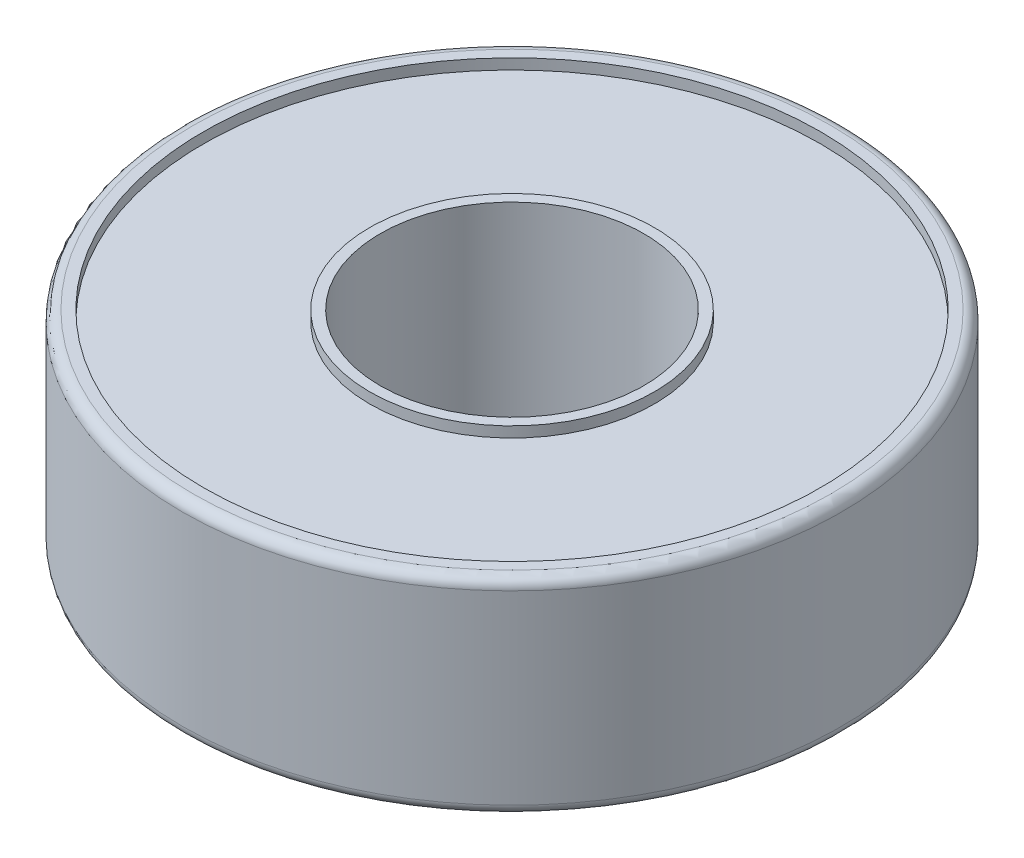
ISO-10303-21;
HEADER;
FILE_DESCRIPTION(('STEP AP214'),'2;1');
FILE_NAME('part.step','',(''),(''),'','','');
FILE_SCHEMA(('AUTOMOTIVE_DESIGN { 1 0 10303 214 1 1 1 1 }'));
ENDSEC;
DATA;
#1=APPLICATION_CONTEXT('core data for automotive mechanical design processes');
#2=APPLICATION_PROTOCOL_DEFINITION('international standard','automotive_design',2000,#1);
#3=PRODUCT_CONTEXT('',#1,'mechanical');
#4=PRODUCT('Part','Part','',(#3));
#5=PRODUCT_RELATED_PRODUCT_CATEGORY('part','',(#4));
#6=PRODUCT_DEFINITION_FORMATION('','',#4);
#7=PRODUCT_DEFINITION_CONTEXT('part definition',#1,'design');
#8=PRODUCT_DEFINITION('design','',#6,#7);
#9=PRODUCT_DEFINITION_SHAPE('','',#8);
#10=(LENGTH_UNIT() NAMED_UNIT(*) SI_UNIT(.MILLI.,.METRE.));
#11=(NAMED_UNIT(*) PLANE_ANGLE_UNIT() SI_UNIT($,.RADIAN.));
#12=(NAMED_UNIT(*) SI_UNIT($,.STERADIAN.) SOLID_ANGLE_UNIT());
#13=UNCERTAINTY_MEASURE_WITH_UNIT(LENGTH_MEASURE(1.E-05),#10,'distance_accuracy_value','');
#14=(GEOMETRIC_REPRESENTATION_CONTEXT(3) GLOBAL_UNCERTAINTY_ASSIGNED_CONTEXT((#13)) GLOBAL_UNIT_ASSIGNED_CONTEXT((#10,
#11,#12)) REPRESENTATION_CONTEXT('',''));
#15=CARTESIAN_POINT('',(0.,0.,0.));
#16=DIRECTION('',(0.,0.,1.));
#17=DIRECTION('',(1.,0.,0.));
#18=AXIS2_PLACEMENT_3D('',#15,#16,#17);
#19=CARTESIAN_POINT('',(0.,-2.4892,0.));
#20=DIRECTION('',(0.,1.,0.));
#21=DIRECTION('',(0.,0.,1.));
#22=AXIS2_PLACEMENT_3D('',#19,#20,#21);
#23=PLANE('',#22);
#24=CARTESIAN_POINT('',(0.,-2.4892,0.));
#25=DIRECTION('',(0.,1.,0.));
#26=DIRECTION('',(0.,0.,1.));
#27=AXIS2_PLACEMENT_3D('',#24,#25,#26);
#28=CIRCLE('',#27,3.175);
#29=CARTESIAN_POINT('',(0.,-2.4892,3.175));
#30=VERTEX_POINT('',#29);
#31=EDGE_CURVE('E61',#30,#30,#28,.T.);
#32=ORIENTED_EDGE('',*,*,#31,.T.);
#33=EDGE_LOOP('',(#32));
#34=FACE_BOUND('',#33,.T.);
#35=CARTESIAN_POINT('',(0.,-2.4892,0.));
#36=DIRECTION('',(0.,1.,0.));
#37=DIRECTION('',(0.,0.,1.));
#38=AXIS2_PLACEMENT_3D('',#35,#36,#37);
#39=CIRCLE('',#38,3.429);
#40=CARTESIAN_POINT('',(0.,-2.4892,3.429));
#41=VERTEX_POINT('',#40);
#42=EDGE_CURVE('E94',#41,#41,#39,.T.);
#43=ORIENTED_EDGE('',*,*,#42,.F.);
#44=EDGE_LOOP('',(#43));
#45=FACE_BOUND('',#44,.T.);
#46=ADVANCED_FACE('F37',(#34,#45),#23,.F.);
#47=CARTESIAN_POINT('',(0.,2.4892,0.));
#48=DIRECTION('',(0.,1.,0.));
#49=DIRECTION('',(0.,0.,1.));
#50=AXIS2_PLACEMENT_3D('',#47,#48,#49);
#51=PLANE('',#50);
#52=CARTESIAN_POINT('',(0.,2.4892,0.));
#53=DIRECTION('',(0.,1.,0.));
#54=DIRECTION('',(0.,0.,1.));
#55=AXIS2_PLACEMENT_3D('',#52,#53,#54);
#56=CIRCLE('',#55,3.175);
#57=CARTESIAN_POINT('',(0.,2.4892,3.175));
#58=VERTEX_POINT('',#57);
#59=EDGE_CURVE('E65',#58,#58,#56,.T.);
#60=ORIENTED_EDGE('',*,*,#59,.F.);
#61=EDGE_LOOP('',(#60));
#62=FACE_BOUND('',#61,.T.);
#63=CARTESIAN_POINT('',(0.,2.4892,0.));
#64=DIRECTION('',(0.,1.,0.));
#65=DIRECTION('',(0.,0.,1.));
#66=AXIS2_PLACEMENT_3D('',#63,#64,#65);
#67=CIRCLE('',#66,3.429);
#68=CARTESIAN_POINT('',(0.,2.4892,3.429));
#69=VERTEX_POINT('',#68);
#70=EDGE_CURVE('E78',#69,#69,#67,.T.);
#71=ORIENTED_EDGE('',*,*,#70,.T.);
#72=EDGE_LOOP('',(#71));
#73=FACE_BOUND('',#72,.T.);
#74=ADVANCED_FACE('F112',(#62,#73),#51,.T.);
#75=CARTESIAN_POINT('',(0.,-2.4892,0.));
#76=DIRECTION('',(0.,1.,0.));
#77=DIRECTION('',(0.,0.,1.));
#78=AXIS2_PLACEMENT_3D('',#75,#76,#77);
#79=CYLINDRICAL_SURFACE('',#78,7.9375);
#80=CARTESIAN_POINT('',(0.,-2.2352,0.));
#81=DIRECTION('',(0.,1.,0.));
#82=DIRECTION('',(0.,0.,1.));
#83=AXIS2_PLACEMENT_3D('',#80,#81,#82);
#84=CIRCLE('',#83,7.9375);
#85=CARTESIAN_POINT('',(0.,-2.2352,7.9375));
#86=VERTEX_POINT('',#85);
#87=EDGE_CURVE('E50',#86,#86,#84,.T.);
#88=ORIENTED_EDGE('',*,*,#87,.T.);
#89=EDGE_LOOP('',(#88));
#90=FACE_BOUND('',#89,.T.);
#91=CARTESIAN_POINT('',(0.,2.2352,0.));
#92=DIRECTION('',(0.,1.,0.));
#93=DIRECTION('',(0.,0.,1.));
#94=AXIS2_PLACEMENT_3D('',#91,#92,#93);
#95=CIRCLE('',#94,7.9375);
#96=CARTESIAN_POINT('',(0.,2.2352,7.9375));
#97=VERTEX_POINT('',#96);
#98=EDGE_CURVE('E55',#97,#97,#95,.F.);
#99=ORIENTED_EDGE('',*,*,#98,.T.);
#100=EDGE_LOOP('',(#99));
#101=FACE_BOUND('',#100,.T.);
#102=ADVANCED_FACE('F119',(#90,#101),#79,.T.);
#103=CARTESIAN_POINT('',(0.,-2.4892,0.));
#104=DIRECTION('',(0.,1.,0.));
#105=DIRECTION('',(0.,0.,1.));
#106=AXIS2_PLACEMENT_3D('',#103,#104,#105);
#107=CIRCLE('',#106,7.4295);
#108=CARTESIAN_POINT('',(0.,-2.4892,7.4295));
#109=VERTEX_POINT('',#108);
#110=EDGE_CURVE('E86',#109,#109,#107,.T.);
#111=ORIENTED_EDGE('',*,*,#110,.T.);
#112=EDGE_LOOP('',(#111));
#113=FACE_BOUND('',#112,.T.);
#114=CARTESIAN_POINT('',(0.,-2.4892,0.));
#115=DIRECTION('',(0.,1.,0.));
#116=DIRECTION('',(0.,0.,1.));
#117=AXIS2_PLACEMENT_3D('',#114,#115,#116);
#118=CIRCLE('',#117,7.6835);
#119=CARTESIAN_POINT('',(0.,-2.4892,7.6835));
#120=VERTEX_POINT('',#119);
#121=EDGE_CURVE('E45',#120,#120,#118,.F.);
#122=ORIENTED_EDGE('',*,*,#121,.T.);
#123=EDGE_LOOP('',(#122));
#124=FACE_BOUND('',#123,.T.);
#125=ADVANCED_FACE('F115',(#113,#124),#23,.F.);
#126=CARTESIAN_POINT('',(0.,-2.4892,0.));
#127=DIRECTION('',(0.,1.,0.));
#128=DIRECTION('',(0.,0.,1.));
#129=AXIS2_PLACEMENT_3D('',#126,#127,#128);
#130=CYLINDRICAL_SURFACE('',#129,3.175);
#131=ORIENTED_EDGE('',*,*,#31,.F.);
#132=EDGE_LOOP('',(#131));
#133=FACE_BOUND('',#132,.T.);
#134=ORIENTED_EDGE('',*,*,#59,.T.);
#135=EDGE_LOOP('',(#134));
#136=FACE_BOUND('',#135,.T.);
#137=ADVANCED_FACE('F126',(#133,#136),#130,.F.);
#138=CARTESIAN_POINT('',(0.,2.4892,0.));
#139=DIRECTION('',(0.,1.,0.));
#140=DIRECTION('',(0.,0.,1.));
#141=AXIS2_PLACEMENT_3D('',#138,#139,#140);
#142=CIRCLE('',#141,7.4295);
#143=CARTESIAN_POINT('',(0.,2.4892,7.4295));
#144=VERTEX_POINT('',#143);
#145=EDGE_CURVE('E70',#144,#144,#142,.T.);
#146=ORIENTED_EDGE('',*,*,#145,.F.);
#147=EDGE_LOOP('',(#146));
#148=FACE_BOUND('',#147,.T.);
#149=CARTESIAN_POINT('',(0.,2.4892,0.));
#150=DIRECTION('',(0.,1.,0.));
#151=DIRECTION('',(0.,0.,1.));
#152=AXIS2_PLACEMENT_3D('',#149,#150,#151);
#153=CIRCLE('',#152,7.6835);
#154=CARTESIAN_POINT('',(0.,2.4892,7.6835));
#155=VERTEX_POINT('',#154);
#156=EDGE_CURVE('E10',#155,#155,#153,.T.);
#157=ORIENTED_EDGE('',*,*,#156,.T.);
#158=EDGE_LOOP('',(#157));
#159=FACE_BOUND('',#158,.T.);
#160=ADVANCED_FACE('F122',(#148,#159),#51,.T.);
#161=CARTESIAN_POINT('',(0.,-2.2352,0.));
#162=DIRECTION('',(0.,1.,0.));
#163=DIRECTION('',(0.,0.,1.));
#164=AXIS2_PLACEMENT_3D('',#161,#162,#163);
#165=TOROIDAL_SURFACE('',#164,7.6835,0.254);
#166=ORIENTED_EDGE('',*,*,#121,.F.);
#167=EDGE_LOOP('',(#166));
#168=FACE_BOUND('',#167,.T.);
#169=ORIENTED_EDGE('',*,*,#87,.F.);
#170=EDGE_LOOP('',(#169));
#171=FACE_BOUND('',#170,.T.);
#172=ADVANCED_FACE('F157',(#168,#171),#165,.T.);
#173=CARTESIAN_POINT('',(0.,2.2352,0.));
#174=DIRECTION('',(0.,1.,0.));
#175=DIRECTION('',(0.,0.,1.));
#176=AXIS2_PLACEMENT_3D('',#173,#174,#175);
#177=TOROIDAL_SURFACE('',#176,7.6835,0.254);
#178=ORIENTED_EDGE('',*,*,#98,.F.);
#179=EDGE_LOOP('',(#178));
#180=FACE_BOUND('',#179,.T.);
#181=ORIENTED_EDGE('',*,*,#156,.F.);
#182=EDGE_LOOP('',(#181));
#183=FACE_BOUND('',#182,.T.);
#184=ADVANCED_FACE('F39',(#180,#183),#177,.T.);
#185=CARTESIAN_POINT('',(0.,2.2352,0.));
#186=DIRECTION('',(0.,1.,0.));
#187=DIRECTION('',(0.,0.,1.));
#188=AXIS2_PLACEMENT_3D('',#185,#186,#187);
#189=CYLINDRICAL_SURFACE('',#188,7.4295);
#190=CARTESIAN_POINT('',(0.,2.2352,0.));
#191=DIRECTION('',(0.,1.,0.));
#192=DIRECTION('',(0.,0.,1.));
#193=AXIS2_PLACEMENT_3D('',#190,#191,#192);
#194=CIRCLE('',#193,7.4295);
#195=CARTESIAN_POINT('',(0.,2.2352,7.4295));
#196=VERTEX_POINT('',#195);
#197=EDGE_CURVE('E69',#196,#196,#194,.T.);
#198=ORIENTED_EDGE('',*,*,#197,.F.);
#199=EDGE_LOOP('',(#198));
#200=FACE_BOUND('',#199,.T.);
#201=ORIENTED_EDGE('',*,*,#145,.T.);
#202=EDGE_LOOP('',(#201));
#203=FACE_BOUND('',#202,.T.);
#204=ADVANCED_FACE('F152',(#200,#203),#189,.F.);
#205=CARTESIAN_POINT('',(0.,2.2352,0.));
#206=DIRECTION('',(0.,1.,0.));
#207=DIRECTION('',(0.,0.,1.));
#208=AXIS2_PLACEMENT_3D('',#205,#206,#207);
#209=PLANE('',#208);
#210=CARTESIAN_POINT('',(0.,2.2352,0.));
#211=DIRECTION('',(0.,1.,0.));
#212=DIRECTION('',(0.,0.,1.));
#213=AXIS2_PLACEMENT_3D('',#210,#211,#212);
#214=CIRCLE('',#213,3.429);
#215=CARTESIAN_POINT('',(0.,2.2352,3.429));
#216=VERTEX_POINT('',#215);
#217=EDGE_CURVE('E74',#216,#216,#214,.T.);
#218=ORIENTED_EDGE('',*,*,#217,.F.);
#219=EDGE_LOOP('',(#218));
#220=FACE_BOUND('',#219,.T.);
#221=ORIENTED_EDGE('',*,*,#197,.T.);
#222=EDGE_LOOP('',(#221));
#223=FACE_BOUND('',#222,.T.);
#224=ADVANCED_FACE('F148',(#220,#223),#209,.T.);
#225=CARTESIAN_POINT('',(0.,2.2352,0.));
#226=DIRECTION('',(0.,1.,0.));
#227=DIRECTION('',(0.,0.,1.));
#228=AXIS2_PLACEMENT_3D('',#225,#226,#227);
#229=CYLINDRICAL_SURFACE('',#228,3.429);
#230=ORIENTED_EDGE('',*,*,#217,.T.);
#231=EDGE_LOOP('',(#230));
#232=FACE_BOUND('',#231,.T.);
#233=ORIENTED_EDGE('',*,*,#70,.F.);
#234=EDGE_LOOP('',(#233));
#235=FACE_BOUND('',#234,.T.);
#236=ADVANCED_FACE('F142',(#232,#235),#229,.T.);
#237=CARTESIAN_POINT('',(0.,-2.2352,0.));
#238=DIRECTION('',(0.,-1.,0.));
#239=DIRECTION('',(0.,0.,1.));
#240=AXIS2_PLACEMENT_3D('',#237,#238,#239);
#241=PLANE('',#240);
#242=CARTESIAN_POINT('',(0.,-2.2352,0.));
#243=DIRECTION('',(0.,1.,0.));
#244=DIRECTION('',(0.,0.,1.));
#245=AXIS2_PLACEMENT_3D('',#242,#243,#244);
#246=CIRCLE('',#245,7.4295);
#247=CARTESIAN_POINT('',(0.,-2.2352,7.4295));
#248=VERTEX_POINT('',#247);
#249=EDGE_CURVE('E82',#248,#248,#246,.T.);
#250=ORIENTED_EDGE('',*,*,#249,.F.);
#251=EDGE_LOOP('',(#250));
#252=FACE_BOUND('',#251,.T.);
#253=CARTESIAN_POINT('',(0.,-2.2352,0.));
#254=DIRECTION('',(0.,1.,0.));
#255=DIRECTION('',(0.,0.,1.));
#256=AXIS2_PLACEMENT_3D('',#253,#254,#255);
#257=CIRCLE('',#256,3.429);
#258=CARTESIAN_POINT('',(0.,-2.2352,3.429));
#259=VERTEX_POINT('',#258);
#260=EDGE_CURVE('E90',#259,#259,#257,.T.);
#261=ORIENTED_EDGE('',*,*,#260,.T.);
#262=EDGE_LOOP('',(#261));
#263=FACE_BOUND('',#262,.T.);
#264=ADVANCED_FACE('F102',(#252,#263),#241,.T.);
#265=CARTESIAN_POINT('',(0.,-2.2352,0.));
#266=DIRECTION('',(0.,-1.,0.));
#267=DIRECTION('',(0.,0.,-1.));
#268=AXIS2_PLACEMENT_3D('',#265,#266,#267);
#269=CYLINDRICAL_SURFACE('',#268,7.4295);
#270=ORIENTED_EDGE('',*,*,#249,.T.);
#271=EDGE_LOOP('',(#270));
#272=FACE_BOUND('',#271,.T.);
#273=ORIENTED_EDGE('',*,*,#110,.F.);
#274=EDGE_LOOP('',(#273));
#275=FACE_BOUND('',#274,.T.);
#276=ADVANCED_FACE('F107',(#272,#275),#269,.F.);
#277=CARTESIAN_POINT('',(0.,-2.2352,0.));
#278=DIRECTION('',(0.,-1.,0.));
#279=DIRECTION('',(0.,0.,-1.));
#280=AXIS2_PLACEMENT_3D('',#277,#278,#279);
#281=CYLINDRICAL_SURFACE('',#280,3.429);
#282=ORIENTED_EDGE('',*,*,#260,.F.);
#283=EDGE_LOOP('',(#282));
#284=FACE_BOUND('',#283,.T.);
#285=ORIENTED_EDGE('',*,*,#42,.T.);
#286=EDGE_LOOP('',(#285));
#287=FACE_BOUND('',#286,.T.);
#288=ADVANCED_FACE('F104',(#284,#287),#281,.T.);
#289=CLOSED_SHELL('',(#46,#74,#102,#125,#137,#160,#172,#184,#204,#224,#236,#264,#276,#288));
#290=MANIFOLD_SOLID_BREP('B2',#289);
#291=ADVANCED_BREP_SHAPE_REPRESENTATION('',(#18,#290),#14);
#292=SHAPE_DEFINITION_REPRESENTATION(#9,#291);
ENDSEC;
END-ISO-10303-21;
